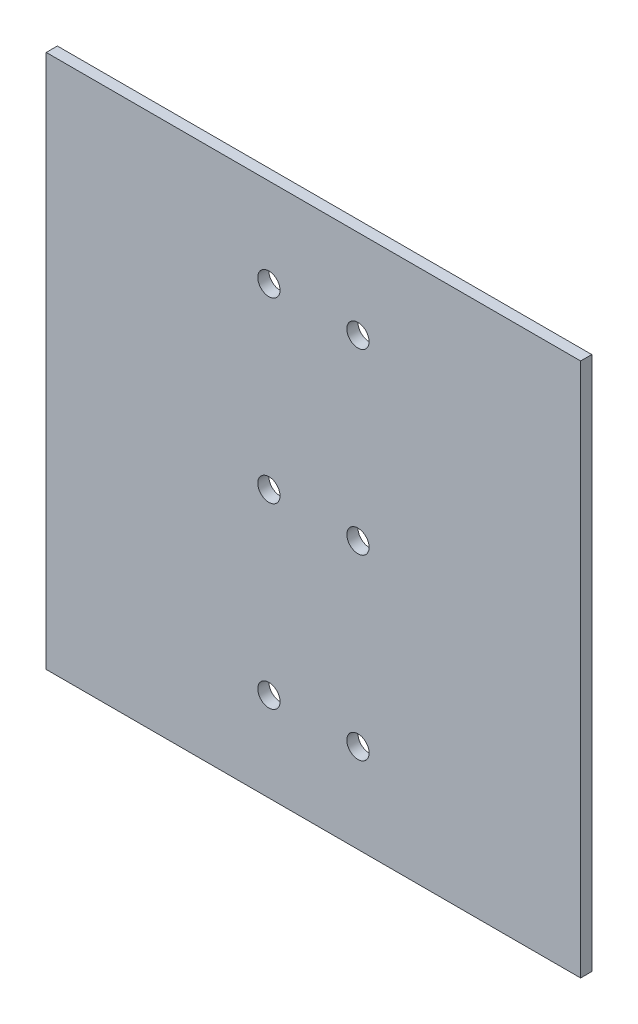
ISO-10303-21;
HEADER;
FILE_DESCRIPTION(('STEP AP214'),'2;1');
FILE_NAME('part.step','',(''),(''),'','','');
FILE_SCHEMA(('AUTOMOTIVE_DESIGN { 1 0 10303 214 1 1 1 1 }'));
ENDSEC;
DATA;
#1=APPLICATION_CONTEXT('core data for automotive mechanical design processes');
#2=APPLICATION_PROTOCOL_DEFINITION('international standard','automotive_design',2000,#1);
#3=PRODUCT_CONTEXT('',#1,'mechanical');
#4=PRODUCT('Part','Part','',(#3));
#5=PRODUCT_RELATED_PRODUCT_CATEGORY('part','',(#4));
#6=PRODUCT_DEFINITION_FORMATION('','',#4);
#7=PRODUCT_DEFINITION_CONTEXT('part definition',#1,'design');
#8=PRODUCT_DEFINITION('design','',#6,#7);
#9=PRODUCT_DEFINITION_SHAPE('','',#8);
#10=(LENGTH_UNIT() NAMED_UNIT(*) SI_UNIT(.MILLI.,.METRE.));
#11=(NAMED_UNIT(*) PLANE_ANGLE_UNIT() SI_UNIT($,.RADIAN.));
#12=(NAMED_UNIT(*) SI_UNIT($,.STERADIAN.) SOLID_ANGLE_UNIT());
#13=UNCERTAINTY_MEASURE_WITH_UNIT(LENGTH_MEASURE(1.E-05),#10,'distance_accuracy_value','');
#14=(GEOMETRIC_REPRESENTATION_CONTEXT(3) GLOBAL_UNCERTAINTY_ASSIGNED_CONTEXT((#13)) GLOBAL_UNIT_ASSIGNED_CONTEXT((#10,
#11,#12)) REPRESENTATION_CONTEXT('',''));
#15=CARTESIAN_POINT('',(0.,0.,0.));
#16=DIRECTION('',(0.,0.,1.));
#17=DIRECTION('',(1.,0.,0.));
#18=AXIS2_PLACEMENT_3D('',#15,#16,#17);
#19=CARTESIAN_POINT('',(0.,0.,6.35));
#20=DIRECTION('',(0.,0.,-1.));
#21=DIRECTION('',(-1.,0.,0.));
#22=AXIS2_PLACEMENT_3D('',#19,#20,#21);
#23=PLANE('',#22);
#24=DIRECTION('',(0.,-1.,0.));
#25=VECTOR('',#24,1.);
#26=CARTESIAN_POINT('',(0.,0.,6.35));
#27=LINE('',#26,#25);
#28=CARTESIAN_POINT('',(0.,304.8,6.35));
#29=VERTEX_POINT('',#28);
#30=CARTESIAN_POINT('',(0.,0.,6.35));
#31=VERTEX_POINT('',#30);
#32=EDGE_CURVE('E92',#29,#31,#27,.T.);
#33=ORIENTED_EDGE('',*,*,#32,.T.);
#34=DIRECTION('',(1.,0.,0.));
#35=VECTOR('',#34,1.);
#36=CARTESIAN_POINT('',(0.,0.,6.35));
#37=LINE('',#36,#35);
#38=CARTESIAN_POINT('',(304.8,0.,6.35));
#39=VERTEX_POINT('',#38);
#40=EDGE_CURVE('E87',#31,#39,#37,.T.);
#41=ORIENTED_EDGE('',*,*,#40,.T.);
#42=DIRECTION('',(0.,1.,0.));
#43=VECTOR('',#42,1.);
#44=CARTESIAN_POINT('',(304.8,0.,6.35));
#45=LINE('',#44,#43);
#46=CARTESIAN_POINT('',(304.8,304.8,6.35));
#47=VERTEX_POINT('',#46);
#48=EDGE_CURVE('E90',#39,#47,#45,.T.);
#49=ORIENTED_EDGE('',*,*,#48,.T.);
#50=DIRECTION('',(-1.,0.,0.));
#51=VECTOR('',#50,1.);
#52=CARTESIAN_POINT('',(0.,304.8,6.35));
#53=LINE('',#52,#51);
#54=EDGE_CURVE('E57',#47,#29,#53,.T.);
#55=ORIENTED_EDGE('',*,*,#54,.T.);
#56=EDGE_LOOP('',(#33,#41,#49,#55));
#57=FACE_BOUND('',#56,.T.);
#58=CARTESIAN_POINT('',(177.8,50.8,6.35));
#59=DIRECTION('',(0.,0.,1.));
#60=DIRECTION('',(1.,0.,0.));
#61=AXIS2_PLACEMENT_3D('',#58,#59,#60);
#62=CIRCLE('',#61,6.35);
#63=CARTESIAN_POINT('',(184.15,50.8,6.35));
#64=VERTEX_POINT('',#63);
#65=EDGE_CURVE('E112',#64,#64,#62,.T.);
#66=ORIENTED_EDGE('',*,*,#65,.F.);
#67=EDGE_LOOP('',(#66));
#68=FACE_BOUND('',#67,.T.);
#69=CARTESIAN_POINT('',(127.,50.7999999999999,6.35));
#70=DIRECTION('',(0.,0.,1.));
#71=DIRECTION('',(1.,0.,0.));
#72=AXIS2_PLACEMENT_3D('',#69,#70,#71);
#73=CIRCLE('',#72,6.35);
#74=CARTESIAN_POINT('',(133.35,50.7999999999999,6.35));
#75=VERTEX_POINT('',#74);
#76=EDGE_CURVE('E134',#75,#75,#73,.T.);
#77=ORIENTED_EDGE('',*,*,#76,.F.);
#78=EDGE_LOOP('',(#77));
#79=FACE_BOUND('',#78,.T.);
#80=CARTESIAN_POINT('',(127.,152.4,6.35));
#81=DIRECTION('',(0.,0.,1.));
#82=DIRECTION('',(1.,0.,0.));
#83=AXIS2_PLACEMENT_3D('',#80,#81,#82);
#84=CIRCLE('',#83,6.34999999999994);
#85=CARTESIAN_POINT('',(133.35,152.4,6.35));
#86=VERTEX_POINT('',#85);
#87=EDGE_CURVE('E142',#86,#86,#84,.T.);
#88=ORIENTED_EDGE('',*,*,#87,.F.);
#89=EDGE_LOOP('',(#88));
#90=FACE_BOUND('',#89,.T.);
#91=CARTESIAN_POINT('',(127.,254.,6.35));
#92=DIRECTION('',(0.,0.,1.));
#93=DIRECTION('',(1.,0.,0.));
#94=AXIS2_PLACEMENT_3D('',#91,#92,#93);
#95=CIRCLE('',#94,6.34999999999994);
#96=CARTESIAN_POINT('',(133.35,254.,6.35));
#97=VERTEX_POINT('',#96);
#98=EDGE_CURVE('E150',#97,#97,#95,.T.);
#99=ORIENTED_EDGE('',*,*,#98,.F.);
#100=EDGE_LOOP('',(#99));
#101=FACE_BOUND('',#100,.T.);
#102=CARTESIAN_POINT('',(177.8,152.4,6.35));
#103=DIRECTION('',(0.,0.,1.));
#104=DIRECTION('',(1.,0.,0.));
#105=AXIS2_PLACEMENT_3D('',#102,#103,#104);
#106=CIRCLE('',#105,6.34999999999994);
#107=CARTESIAN_POINT('',(184.15,152.4,6.35));
#108=VERTEX_POINT('',#107);
#109=EDGE_CURVE('E158',#108,#108,#106,.T.);
#110=ORIENTED_EDGE('',*,*,#109,.F.);
#111=EDGE_LOOP('',(#110));
#112=FACE_BOUND('',#111,.T.);
#113=CARTESIAN_POINT('',(177.8,254.,6.35));
#114=DIRECTION('',(0.,0.,1.));
#115=DIRECTION('',(1.,0.,0.));
#116=AXIS2_PLACEMENT_3D('',#113,#114,#115);
#117=CIRCLE('',#116,6.34999999999994);
#118=CARTESIAN_POINT('',(184.15,254.,6.35));
#119=VERTEX_POINT('',#118);
#120=EDGE_CURVE('E166',#119,#119,#117,.T.);
#121=ORIENTED_EDGE('',*,*,#120,.F.);
#122=EDGE_LOOP('',(#121));
#123=FACE_BOUND('',#122,.T.);
#124=ADVANCED_FACE('F39',(#57,#68,#79,#90,#101,#112,#123),#23,.F.);
#125=CARTESIAN_POINT('',(0.,0.,0.));
#126=DIRECTION('',(0.,0.,-1.));
#127=DIRECTION('',(-1.,0.,0.));
#128=AXIS2_PLACEMENT_3D('',#125,#126,#127);
#129=PLANE('',#128);
#130=CARTESIAN_POINT('',(177.8,152.4,0.));
#131=DIRECTION('',(0.,0.,1.));
#132=DIRECTION('',(1.,0.,0.));
#133=AXIS2_PLACEMENT_3D('',#130,#131,#132);
#134=CIRCLE('',#133,6.34999999999994);
#135=CARTESIAN_POINT('',(184.15,152.4,0.));
#136=VERTEX_POINT('',#135);
#137=EDGE_CURVE('E162',#136,#136,#134,.T.);
#138=ORIENTED_EDGE('',*,*,#137,.T.);
#139=EDGE_LOOP('',(#138));
#140=FACE_BOUND('',#139,.T.);
#141=CARTESIAN_POINT('',(127.,152.4,0.));
#142=DIRECTION('',(0.,0.,1.));
#143=DIRECTION('',(1.,0.,0.));
#144=AXIS2_PLACEMENT_3D('',#141,#142,#143);
#145=CIRCLE('',#144,6.34999999999994);
#146=CARTESIAN_POINT('',(133.35,152.4,0.));
#147=VERTEX_POINT('',#146);
#148=EDGE_CURVE('E146',#147,#147,#145,.T.);
#149=ORIENTED_EDGE('',*,*,#148,.T.);
#150=EDGE_LOOP('',(#149));
#151=FACE_BOUND('',#150,.T.);
#152=CARTESIAN_POINT('',(177.8,50.8,0.));
#153=DIRECTION('',(0.,0.,1.));
#154=DIRECTION('',(1.,0.,0.));
#155=AXIS2_PLACEMENT_3D('',#152,#153,#154);
#156=CIRCLE('',#155,6.35);
#157=CARTESIAN_POINT('',(184.15,50.8,0.));
#158=VERTEX_POINT('',#157);
#159=EDGE_CURVE('E130',#158,#158,#156,.T.);
#160=ORIENTED_EDGE('',*,*,#159,.T.);
#161=EDGE_LOOP('',(#160));
#162=FACE_BOUND('',#161,.T.);
#163=DIRECTION('',(0.,-1.,0.));
#164=VECTOR('',#163,1.);
#165=CARTESIAN_POINT('',(0.,0.,0.));
#166=LINE('',#165,#164);
#167=CARTESIAN_POINT('',(0.,304.8,0.));
#168=VERTEX_POINT('',#167);
#169=CARTESIAN_POINT('',(0.,0.,0.));
#170=VERTEX_POINT('',#169);
#171=EDGE_CURVE('E108',#168,#170,#166,.T.);
#172=ORIENTED_EDGE('',*,*,#171,.F.);
#173=DIRECTION('',(-1.,0.,0.));
#174=VECTOR('',#173,1.);
#175=CARTESIAN_POINT('',(0.,304.8,0.));
#176=LINE('',#175,#174);
#177=CARTESIAN_POINT('',(304.8,304.8,0.));
#178=VERTEX_POINT('',#177);
#179=EDGE_CURVE('E80',#178,#168,#176,.T.);
#180=ORIENTED_EDGE('',*,*,#179,.F.);
#181=DIRECTION('',(0.,1.,0.));
#182=VECTOR('',#181,1.);
#183=CARTESIAN_POINT('',(304.8,0.,0.));
#184=LINE('',#183,#182);
#185=CARTESIAN_POINT('',(304.8,0.,0.));
#186=VERTEX_POINT('',#185);
#187=EDGE_CURVE('E74',#186,#178,#184,.T.);
#188=ORIENTED_EDGE('',*,*,#187,.F.);
#189=DIRECTION('',(1.,0.,0.));
#190=VECTOR('',#189,1.);
#191=CARTESIAN_POINT('',(0.,0.,0.));
#192=LINE('',#191,#190);
#193=EDGE_CURVE('E97',#170,#186,#192,.T.);
#194=ORIENTED_EDGE('',*,*,#193,.F.);
#195=EDGE_LOOP('',(#172,#180,#188,#194));
#196=FACE_BOUND('',#195,.T.);
#197=CARTESIAN_POINT('',(127.,50.7999999999999,0.));
#198=DIRECTION('',(0.,0.,1.));
#199=DIRECTION('',(1.,0.,0.));
#200=AXIS2_PLACEMENT_3D('',#197,#198,#199);
#201=CIRCLE('',#200,6.35);
#202=CARTESIAN_POINT('',(133.35,50.7999999999999,0.));
#203=VERTEX_POINT('',#202);
#204=EDGE_CURVE('E138',#203,#203,#201,.T.);
#205=ORIENTED_EDGE('',*,*,#204,.T.);
#206=EDGE_LOOP('',(#205));
#207=FACE_BOUND('',#206,.T.);
#208=CARTESIAN_POINT('',(127.,254.,0.));
#209=DIRECTION('',(0.,0.,1.));
#210=DIRECTION('',(1.,0.,0.));
#211=AXIS2_PLACEMENT_3D('',#208,#209,#210);
#212=CIRCLE('',#211,6.34999999999994);
#213=CARTESIAN_POINT('',(133.35,254.,0.));
#214=VERTEX_POINT('',#213);
#215=EDGE_CURVE('E154',#214,#214,#212,.T.);
#216=ORIENTED_EDGE('',*,*,#215,.T.);
#217=EDGE_LOOP('',(#216));
#218=FACE_BOUND('',#217,.T.);
#219=CARTESIAN_POINT('',(177.8,254.,0.));
#220=DIRECTION('',(0.,0.,1.));
#221=DIRECTION('',(1.,0.,0.));
#222=AXIS2_PLACEMENT_3D('',#219,#220,#221);
#223=CIRCLE('',#222,6.34999999999994);
#224=CARTESIAN_POINT('',(184.15,254.,0.));
#225=VERTEX_POINT('',#224);
#226=EDGE_CURVE('E170',#225,#225,#223,.T.);
#227=ORIENTED_EDGE('',*,*,#226,.T.);
#228=EDGE_LOOP('',(#227));
#229=FACE_BOUND('',#228,.T.);
#230=ADVANCED_FACE('F125',(#140,#151,#162,#196,#207,#218,#229),#129,.T.);
#231=CARTESIAN_POINT('',(0.,0.,6.35));
#232=DIRECTION('',(1.,0.,0.));
#233=DIRECTION('',(0.,0.,-1.));
#234=AXIS2_PLACEMENT_3D('',#231,#232,#233);
#235=PLANE('',#234);
#236=ORIENTED_EDGE('',*,*,#171,.T.);
#237=DIRECTION('',(0.,0.,-1.));
#238=VECTOR('',#237,1.);
#239=CARTESIAN_POINT('',(0.,0.,6.35));
#240=LINE('',#239,#238);
#241=EDGE_CURVE('E11',#31,#170,#240,.T.);
#242=ORIENTED_EDGE('',*,*,#241,.F.);
#243=ORIENTED_EDGE('',*,*,#32,.F.);
#244=DIRECTION('',(0.,0.,-1.));
#245=VECTOR('',#244,1.);
#246=CARTESIAN_POINT('',(0.,304.8,6.35));
#247=LINE('',#246,#245);
#248=EDGE_CURVE('E104',#29,#168,#247,.T.);
#249=ORIENTED_EDGE('',*,*,#248,.T.);
#250=EDGE_LOOP('',(#236,#242,#243,#249));
#251=FACE_BOUND('',#250,.T.);
#252=ADVANCED_FACE('F41',(#251),#235,.F.);
#253=CARTESIAN_POINT('',(0.,0.,6.35));
#254=DIRECTION('',(0.,1.,0.));
#255=DIRECTION('',(-1.,0.,0.));
#256=AXIS2_PLACEMENT_3D('',#253,#254,#255);
#257=PLANE('',#256);
#258=ORIENTED_EDGE('',*,*,#193,.T.);
#259=DIRECTION('',(0.,0.,-1.));
#260=VECTOR('',#259,1.);
#261=CARTESIAN_POINT('',(304.8,0.,6.35));
#262=LINE('',#261,#260);
#263=EDGE_CURVE('E49',#39,#186,#262,.T.);
#264=ORIENTED_EDGE('',*,*,#263,.F.);
#265=ORIENTED_EDGE('',*,*,#40,.F.);
#266=ORIENTED_EDGE('',*,*,#241,.T.);
#267=EDGE_LOOP('',(#258,#264,#265,#266));
#268=FACE_BOUND('',#267,.T.);
#269=ADVANCED_FACE('F96',(#268),#257,.F.);
#270=CARTESIAN_POINT('',(304.8,0.,6.35));
#271=DIRECTION('',(-1.,0.,0.));
#272=DIRECTION('',(0.,0.,1.));
#273=AXIS2_PLACEMENT_3D('',#270,#271,#272);
#274=PLANE('',#273);
#275=ORIENTED_EDGE('',*,*,#187,.T.);
#276=DIRECTION('',(0.,0.,-1.));
#277=VECTOR('',#276,1.);
#278=CARTESIAN_POINT('',(304.8,304.8,6.35));
#279=LINE('',#278,#277);
#280=EDGE_CURVE('E99',#47,#178,#279,.T.);
#281=ORIENTED_EDGE('',*,*,#280,.F.);
#282=ORIENTED_EDGE('',*,*,#48,.F.);
#283=ORIENTED_EDGE('',*,*,#263,.T.);
#284=EDGE_LOOP('',(#275,#281,#282,#283));
#285=FACE_BOUND('',#284,.T.);
#286=ADVANCED_FACE('F100',(#285),#274,.F.);
#287=CARTESIAN_POINT('',(0.,304.8,6.35));
#288=DIRECTION('',(0.,-1.,0.));
#289=DIRECTION('',(1.,0.,0.));
#290=AXIS2_PLACEMENT_3D('',#287,#288,#289);
#291=PLANE('',#290);
#292=ORIENTED_EDGE('',*,*,#179,.T.);
#293=ORIENTED_EDGE('',*,*,#248,.F.);
#294=ORIENTED_EDGE('',*,*,#54,.F.);
#295=ORIENTED_EDGE('',*,*,#280,.T.);
#296=EDGE_LOOP('',(#292,#293,#294,#295));
#297=FACE_BOUND('',#296,.T.);
#298=ADVANCED_FACE('F122',(#297),#291,.F.);
#299=CARTESIAN_POINT('',(177.8,50.8,6.35));
#300=DIRECTION('',(0.,0.,-1.));
#301=DIRECTION('',(-1.,0.,0.));
#302=AXIS2_PLACEMENT_3D('',#299,#300,#301);
#303=CYLINDRICAL_SURFACE('',#302,6.35);
#304=ORIENTED_EDGE('',*,*,#65,.T.);
#305=EDGE_LOOP('',(#304));
#306=FACE_BOUND('',#305,.T.);
#307=ORIENTED_EDGE('',*,*,#159,.F.);
#308=EDGE_LOOP('',(#307));
#309=FACE_BOUND('',#308,.T.);
#310=ADVANCED_FACE('F189',(#306,#309),#303,.F.);
#311=CARTESIAN_POINT('',(127.,50.7999999999999,6.35));
#312=DIRECTION('',(0.,0.,-1.));
#313=DIRECTION('',(-1.,0.,0.));
#314=AXIS2_PLACEMENT_3D('',#311,#312,#313);
#315=CYLINDRICAL_SURFACE('',#314,6.35);
#316=ORIENTED_EDGE('',*,*,#76,.T.);
#317=EDGE_LOOP('',(#316));
#318=FACE_BOUND('',#317,.T.);
#319=ORIENTED_EDGE('',*,*,#204,.F.);
#320=EDGE_LOOP('',(#319));
#321=FACE_BOUND('',#320,.T.);
#322=ADVANCED_FACE('F235',(#318,#321),#315,.F.);
#323=CARTESIAN_POINT('',(127.,152.4,6.35));
#324=DIRECTION('',(0.,0.,-1.));
#325=DIRECTION('',(-1.,0.,0.));
#326=AXIS2_PLACEMENT_3D('',#323,#324,#325);
#327=CYLINDRICAL_SURFACE('',#326,6.34999999999994);
#328=ORIENTED_EDGE('',*,*,#87,.T.);
#329=EDGE_LOOP('',(#328));
#330=FACE_BOUND('',#329,.T.);
#331=ORIENTED_EDGE('',*,*,#148,.F.);
#332=EDGE_LOOP('',(#331));
#333=FACE_BOUND('',#332,.T.);
#334=ADVANCED_FACE('F243',(#330,#333),#327,.F.);
#335=CARTESIAN_POINT('',(127.,254.,6.35));
#336=DIRECTION('',(0.,0.,-1.));
#337=DIRECTION('',(-1.,0.,0.));
#338=AXIS2_PLACEMENT_3D('',#335,#336,#337);
#339=CYLINDRICAL_SURFACE('',#338,6.34999999999994);
#340=ORIENTED_EDGE('',*,*,#98,.T.);
#341=EDGE_LOOP('',(#340));
#342=FACE_BOUND('',#341,.T.);
#343=ORIENTED_EDGE('',*,*,#215,.F.);
#344=EDGE_LOOP('',(#343));
#345=FACE_BOUND('',#344,.T.);
#346=ADVANCED_FACE('F251',(#342,#345),#339,.F.);
#347=CARTESIAN_POINT('',(177.8,152.4,6.35));
#348=DIRECTION('',(0.,0.,-1.));
#349=DIRECTION('',(-1.,0.,0.));
#350=AXIS2_PLACEMENT_3D('',#347,#348,#349);
#351=CYLINDRICAL_SURFACE('',#350,6.34999999999994);
#352=ORIENTED_EDGE('',*,*,#109,.T.);
#353=EDGE_LOOP('',(#352));
#354=FACE_BOUND('',#353,.T.);
#355=ORIENTED_EDGE('',*,*,#137,.F.);
#356=EDGE_LOOP('',(#355));
#357=FACE_BOUND('',#356,.T.);
#358=ADVANCED_FACE('F260',(#354,#357),#351,.F.);
#359=CARTESIAN_POINT('',(177.8,254.,6.35));
#360=DIRECTION('',(0.,0.,-1.));
#361=DIRECTION('',(-1.,0.,0.));
#362=AXIS2_PLACEMENT_3D('',#359,#360,#361);
#363=CYLINDRICAL_SURFACE('',#362,6.34999999999994);
#364=ORIENTED_EDGE('',*,*,#120,.T.);
#365=EDGE_LOOP('',(#364));
#366=FACE_BOUND('',#365,.T.);
#367=ORIENTED_EDGE('',*,*,#226,.F.);
#368=EDGE_LOOP('',(#367));
#369=FACE_BOUND('',#368,.T.);
#370=ADVANCED_FACE('F178',(#366,#369),#363,.F.);
#371=CLOSED_SHELL('',(#124,#230,#252,#269,#286,#298,#310,#322,#334,#346,#358,#370));
#372=MANIFOLD_SOLID_BREP('B2',#371);
#373=ADVANCED_BREP_SHAPE_REPRESENTATION('',(#18,#372),#14);
#374=SHAPE_DEFINITION_REPRESENTATION(#9,#373);
ENDSEC;
END-ISO-10303-21;
